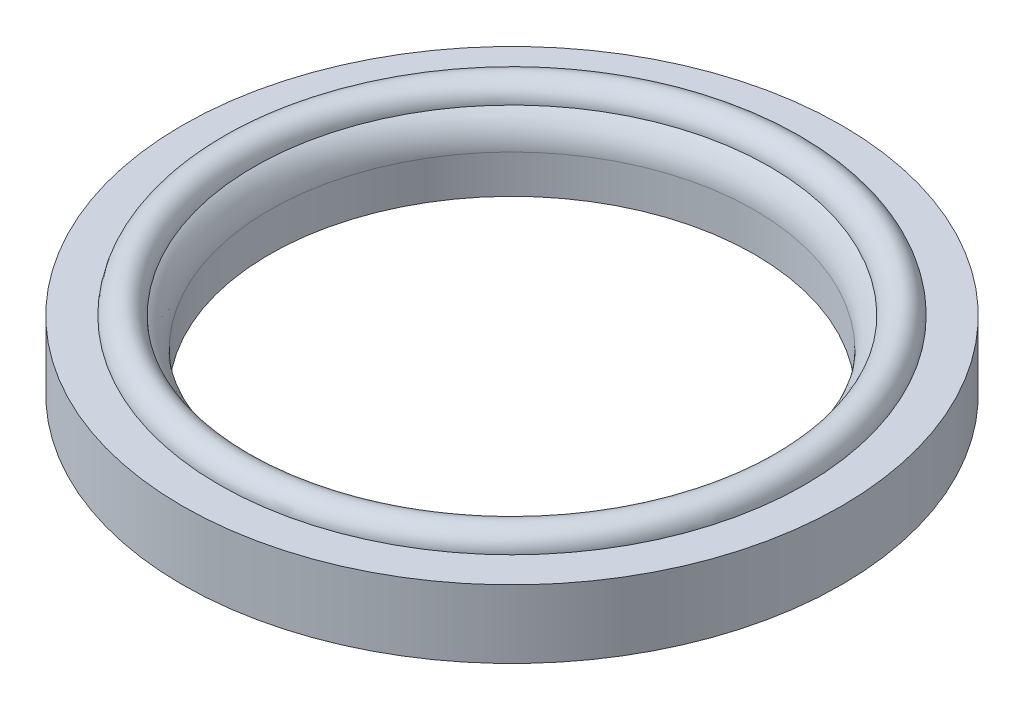
ISO-10303-21;
HEADER;
FILE_DESCRIPTION(('STEP AP214'),'2;1');
FILE_NAME('part.step','',(''),(''),'','','');
FILE_SCHEMA(('AUTOMOTIVE_DESIGN { 1 0 10303 214 1 1 1 1 }'));
ENDSEC;
DATA;
#1=APPLICATION_CONTEXT('core data for automotive mechanical design processes');
#2=APPLICATION_PROTOCOL_DEFINITION('international standard','automotive_design',2000,#1);
#3=PRODUCT_CONTEXT('',#1,'mechanical');
#4=PRODUCT('Part','Part','',(#3));
#5=PRODUCT_RELATED_PRODUCT_CATEGORY('part','',(#4));
#6=PRODUCT_DEFINITION_FORMATION('','',#4);
#7=PRODUCT_DEFINITION_CONTEXT('part definition',#1,'design');
#8=PRODUCT_DEFINITION('design','',#6,#7);
#9=PRODUCT_DEFINITION_SHAPE('','',#8);
#10=(LENGTH_UNIT() NAMED_UNIT(*) SI_UNIT(.MILLI.,.METRE.));
#11=(NAMED_UNIT(*) PLANE_ANGLE_UNIT() SI_UNIT($,.RADIAN.));
#12=(NAMED_UNIT(*) SI_UNIT($,.STERADIAN.) SOLID_ANGLE_UNIT());
#13=UNCERTAINTY_MEASURE_WITH_UNIT(LENGTH_MEASURE(1.E-05),#10,'distance_accuracy_value','');
#14=(GEOMETRIC_REPRESENTATION_CONTEXT(3) GLOBAL_UNCERTAINTY_ASSIGNED_CONTEXT((#13)) GLOBAL_UNIT_ASSIGNED_CONTEXT((#10,
#11,#12)) REPRESENTATION_CONTEXT('',''));
#15=CARTESIAN_POINT('',(0.,0.,0.));
#16=DIRECTION('',(0.,0.,1.));
#17=DIRECTION('',(1.,0.,0.));
#18=AXIS2_PLACEMENT_3D('',#15,#16,#17);
#19=CARTESIAN_POINT('',(0.,4.7625,0.));
#20=DIRECTION('',(0.,1.,0.));
#21=DIRECTION('',(0.,0.,1.));
#22=AXIS2_PLACEMENT_3D('',#19,#20,#21);
#23=PLANE('',#22);
#24=CARTESIAN_POINT('',(0.,4.7625,0.));
#25=DIRECTION('',(0.,1.,0.));
#26=DIRECTION('',(0.,0.,1.));
#27=AXIS2_PLACEMENT_3D('',#24,#25,#26);
#28=CIRCLE('',#27,23.0505);
#29=CARTESIAN_POINT('',(0.,4.7625,-23.0505));
#30=VERTEX_POINT('',#29);
#31=EDGE_CURVE('E47',#30,#30,#28,.T.);
#32=ORIENTED_EDGE('',*,*,#31,.T.);
#33=EDGE_LOOP('',(#32));
#34=FACE_BOUND('',#33,.T.);
#35=CARTESIAN_POINT('',(0.,4.7625,0.));
#36=DIRECTION('',(0.,1.,0.));
#37=DIRECTION('',(0.,0.,1.));
#38=AXIS2_PLACEMENT_3D('',#35,#36,#37);
#39=CIRCLE('',#38,20.476834476402);
#40=CARTESIAN_POINT('',(0.,4.7625,20.476834476402));
#41=VERTEX_POINT('',#40);
#42=EDGE_CURVE('E39',#41,#41,#39,.T.);
#43=ORIENTED_EDGE('',*,*,#42,.F.);
#44=EDGE_LOOP('',(#43));
#45=FACE_BOUND('',#44,.T.);
#46=ADVANCED_FACE('F32',(#34,#45),#23,.T.);
#47=CARTESIAN_POINT('',(0.,0.,0.));
#48=DIRECTION('',(0.,1.,0.));
#49=DIRECTION('',(0.,0.,1.));
#50=AXIS2_PLACEMENT_3D('',#47,#48,#49);
#51=PLANE('',#50);
#52=CARTESIAN_POINT('',(0.,0.,0.));
#53=DIRECTION('',(0.,1.,0.));
#54=DIRECTION('',(0.,0.,1.));
#55=AXIS2_PLACEMENT_3D('',#52,#53,#54);
#56=CIRCLE('',#55,23.0505);
#57=CARTESIAN_POINT('',(0.,0.,-23.0505));
#58=VERTEX_POINT('',#57);
#59=EDGE_CURVE('E50',#58,#58,#56,.T.);
#60=ORIENTED_EDGE('',*,*,#59,.F.);
#61=EDGE_LOOP('',(#60));
#62=FACE_BOUND('',#61,.T.);
#63=CARTESIAN_POINT('',(0.,0.,0.));
#64=DIRECTION('',(0.,1.,0.));
#65=DIRECTION('',(0.,0.,1.));
#66=AXIS2_PLACEMENT_3D('',#63,#64,#65);
#67=CIRCLE('',#66,16.9545);
#68=CARTESIAN_POINT('',(0.,0.,-16.9545));
#69=VERTEX_POINT('',#68);
#70=EDGE_CURVE('E53',#69,#69,#67,.T.);
#71=ORIENTED_EDGE('',*,*,#70,.T.);
#72=EDGE_LOOP('',(#71));
#73=FACE_BOUND('',#72,.T.);
#74=ADVANCED_FACE('F59',(#62,#73),#51,.F.);
#75=CARTESIAN_POINT('',(0.,4.7625,0.));
#76=DIRECTION('',(0.,-1.,0.));
#77=DIRECTION('',(0.,0.,-1.));
#78=AXIS2_PLACEMENT_3D('',#75,#76,#77);
#79=CYLINDRICAL_SURFACE('',#78,23.0505);
#80=CARTESIAN_POINT('',(0.,4.7625,-23.0505));
#81=CARTESIAN_POINT('',(0.,4.712890625,-23.0505));
#82=CARTESIAN_POINT('',(0.,4.66328125,-23.0505));
#83=CARTESIAN_POINT('',(0.,4.5640625,-23.0505));
#84=CARTESIAN_POINT('',(0.,4.514453125,-23.0505));
#85=CARTESIAN_POINT('',(0.,4.415234375,-23.0505));
#86=CARTESIAN_POINT('',(0.,4.365625,-23.0505));
#87=CARTESIAN_POINT('',(0.,4.26640625,-23.0505));
#88=CARTESIAN_POINT('',(0.,4.216796875,-23.0505));
#89=CARTESIAN_POINT('',(0.,4.117578125,-23.0505));
#90=CARTESIAN_POINT('',(0.,4.06796875,-23.0505));
#91=CARTESIAN_POINT('',(0.,3.96875,-23.0505));
#92=CARTESIAN_POINT('',(0.,3.919140625,-23.0505));
#93=CARTESIAN_POINT('',(0.,3.819921875,-23.0505));
#94=CARTESIAN_POINT('',(0.,3.7703125,-23.0505));
#95=CARTESIAN_POINT('',(0.,3.67109375,-23.0505));
#96=CARTESIAN_POINT('',(0.,3.621484375,-23.0505));
#97=CARTESIAN_POINT('',(0.,3.522265625,-23.0505));
#98=CARTESIAN_POINT('',(0.,3.47265625,-23.0505));
#99=CARTESIAN_POINT('',(0.,3.3734375,-23.0505));
#100=CARTESIAN_POINT('',(0.,3.323828125,-23.0505));
#101=CARTESIAN_POINT('',(0.,3.224609375,-23.0505));
#102=CARTESIAN_POINT('',(0.,3.175,-23.0505));
#103=CARTESIAN_POINT('',(0.,3.07578125,-23.0505));
#104=CARTESIAN_POINT('',(0.,3.026171875,-23.0505));
#105=CARTESIAN_POINT('',(0.,2.926953125,-23.0505));
#106=CARTESIAN_POINT('',(0.,2.87734375,-23.0505));
#107=CARTESIAN_POINT('',(0.,2.778125,-23.0505));
#108=CARTESIAN_POINT('',(0.,2.728515625,-23.0505));
#109=CARTESIAN_POINT('',(0.,2.629296875,-23.0505));
#110=CARTESIAN_POINT('',(0.,2.5796875,-23.0505));
#111=CARTESIAN_POINT('',(0.,2.48046875,-23.0505));
#112=CARTESIAN_POINT('',(0.,2.430859375,-23.0505));
#113=CARTESIAN_POINT('',(0.,2.331640625,-23.0505));
#114=CARTESIAN_POINT('',(0.,2.28203125,-23.0505));
#115=CARTESIAN_POINT('',(0.,2.1828125,-23.0505));
#116=CARTESIAN_POINT('',(0.,2.133203125,-23.0505));
#117=CARTESIAN_POINT('',(0.,2.033984375,-23.0505));
#118=CARTESIAN_POINT('',(0.,1.984375,-23.0505));
#119=CARTESIAN_POINT('',(0.,1.88515625,-23.0505));
#120=CARTESIAN_POINT('',(0.,1.835546875,-23.0505));
#121=CARTESIAN_POINT('',(0.,1.736328125,-23.0505));
#122=CARTESIAN_POINT('',(0.,1.68671875,-23.0505));
#123=CARTESIAN_POINT('',(0.,1.5875,-23.0505));
#124=CARTESIAN_POINT('',(0.,1.537890625,-23.0505));
#125=CARTESIAN_POINT('',(0.,1.438671875,-23.0505));
#126=CARTESIAN_POINT('',(0.,1.3890625,-23.0505));
#127=CARTESIAN_POINT('',(0.,1.28984375,-23.0505));
#128=CARTESIAN_POINT('',(0.,1.240234375,-23.0505));
#129=CARTESIAN_POINT('',(0.,1.141015625,-23.0505));
#130=CARTESIAN_POINT('',(0.,1.09140625,-23.0505));
#131=CARTESIAN_POINT('',(0.,0.992187499999999,-23.0505));
#132=CARTESIAN_POINT('',(0.,0.942578124999999,-23.0505));
#133=CARTESIAN_POINT('',(0.,0.843359375,-23.0505));
#134=CARTESIAN_POINT('',(0.,0.79375,-23.0505));
#135=CARTESIAN_POINT('',(0.,0.69453125,-23.0505));
#136=CARTESIAN_POINT('',(0.,0.644921875,-23.0505));
#137=CARTESIAN_POINT('',(0.,0.545703125,-23.0505));
#138=CARTESIAN_POINT('',(0.,0.49609375,-23.0505));
#139=CARTESIAN_POINT('',(0.,0.396875,-23.0505));
#140=CARTESIAN_POINT('',(0.,0.347265625,-23.0505));
#141=CARTESIAN_POINT('',(0.,0.248046875,-23.0505));
#142=CARTESIAN_POINT('',(0.,0.1984375,-23.0505));
#143=CARTESIAN_POINT('',(0.,0.09921875,-23.0505));
#144=CARTESIAN_POINT('',(0.,0.049609375,-23.0505));
#145=CARTESIAN_POINT('',(0.,0.,-23.0505));
#146=B_SPLINE_CURVE_WITH_KNOTS('',3,(#80,#81,#82,#83,#84,#85,#86,#87,#88,#89,#90,#91,#92,#93,
#94,#95,#96,#97,#98,#99,#100,#101,#102,#103,#104,#105,#106,#107,#108,#109,#110,#111,#112,#113,
#114,#115,#116,#117,#118,#119,#120,#121,#122,#123,#124,#125,#126,#127,#128,#129,#130,#131,#132,
#133,#134,#135,#136,#137,#138,#139,#140,#141,#142,#143,#144,#145),.UNSPECIFIED.,.F.,.F.,(4,2,2,
2,2,2,2,2,2,2,2,2,2,2,2,2,2,2,2,2,2,2,2,2,2,2,2,2,2,2,2,2,4),(0.,0.148828125,0.29765625,
0.446484375,0.5953125,0.744140625,0.892968750000001,1.041796875,1.190625,1.339453125,1.48828125,
1.637109375,1.7859375,1.934765625,2.08359375,2.232421875,2.38125,2.530078125,2.67890625,
2.827734375,2.9765625,3.125390625,3.27421875,3.423046875,3.571875,3.720703125,3.86953125,
4.018359375,4.1671875,4.316015625,4.46484375,4.613671875,4.7625),.UNSPECIFIED.);
#147=EDGE_CURVE('BSEAM64',#30,#58,#146,.T.);
#148=ORIENTED_EDGE('',*,*,#31,.F.);
#149=ORIENTED_EDGE('',*,*,#59,.T.);
#150=ORIENTED_EDGE('',*,*,#147,.T.);
#151=ORIENTED_EDGE('',*,*,#147,.F.);
#152=EDGE_LOOP('',(#148,#150,#149,#151));
#153=FACE_BOUND('',#152,.T.);
#154=ADVANCED_FACE('F64',(#153),#79,.T.);
#155=CARTESIAN_POINT('',(0.,4.7625,0.));
#156=DIRECTION('',(0.,-1.,0.));
#157=DIRECTION('',(0.,0.,-1.));
#158=AXIS2_PLACEMENT_3D('',#155,#156,#157);
#159=CYLINDRICAL_SURFACE('',#158,16.9545);
#160=CARTESIAN_POINT('',(0.,2.6840530517009,0.));
#161=DIRECTION('',(0.,1.,0.));
#162=DIRECTION('',(0.,0.,1.));
#163=AXIS2_PLACEMENT_3D('',#160,#161,#162);
#164=CIRCLE('',#163,16.9545);
#165=CARTESIAN_POINT('',(0.,2.6840530517009,-16.9545));
#166=VERTEX_POINT('',#165);
#167=EDGE_CURVE('E10',#166,#166,#164,.T.);
#168=CARTESIAN_POINT('',(0.,2.6840530517009,-16.9545));
#169=CARTESIAN_POINT('',(0.,2.65609416574568,-16.9545));
#170=CARTESIAN_POINT('',(0.,2.62813527979046,-16.9545));
#171=CARTESIAN_POINT('',(0.,2.57221750788003,-16.9545));
#172=CARTESIAN_POINT('',(0.,2.54425862192481,-16.9545));
#173=CARTESIAN_POINT('',(0.,2.48834085001437,-16.9545));
#174=CARTESIAN_POINT('',(0.,2.46038196405916,-16.9545));
#175=CARTESIAN_POINT('',(0.,2.40446419214872,-16.9545));
#176=CARTESIAN_POINT('',(0.,2.3765053061935,-16.9545));
#177=CARTESIAN_POINT('',(0.,2.32058753428307,-16.9545));
#178=CARTESIAN_POINT('',(0.,2.29262864832785,-16.9545));
#179=CARTESIAN_POINT('',(0.,2.23671087641741,-16.9545));
#180=CARTESIAN_POINT('',(0.,2.2087519904622,-16.9545));
#181=CARTESIAN_POINT('',(0.,2.15283421855176,-16.9545));
#182=CARTESIAN_POINT('',(0.,2.12487533259654,-16.9545));
#183=CARTESIAN_POINT('',(0.,2.06895756068611,-16.9545));
#184=CARTESIAN_POINT('',(0.,2.04099867473089,-16.9545));
#185=CARTESIAN_POINT('',(0.,1.98508090282045,-16.9545));
#186=CARTESIAN_POINT('',(0.,1.95712201686524,-16.9545));
#187=CARTESIAN_POINT('',(0.,1.9012042449548,-16.9545));
#188=CARTESIAN_POINT('',(0.,1.87324535899958,-16.9545));
#189=CARTESIAN_POINT('',(0.,1.81732758708915,-16.9545));
#190=CARTESIAN_POINT('',(0.,1.78936870113393,-16.9545));
#191=CARTESIAN_POINT('',(0.,1.7334509292235,-16.9545));
#192=CARTESIAN_POINT('',(0.,1.70549204326828,-16.9545));
#193=CARTESIAN_POINT('',(0.,1.64957427135784,-16.9545));
#194=CARTESIAN_POINT('',(0.,1.62161538540262,-16.9545));
#195=CARTESIAN_POINT('',(0.,1.56569761349219,-16.9545));
#196=CARTESIAN_POINT('',(0.,1.53773872753697,-16.9545));
#197=CARTESIAN_POINT('',(0.,1.48182095562654,-16.9545));
#198=CARTESIAN_POINT('',(0.,1.45386206967132,-16.9545));
#199=CARTESIAN_POINT('',(0.,1.39794429776088,-16.9545));
#200=CARTESIAN_POINT('',(0.,1.36998541180567,-16.9545));
#201=CARTESIAN_POINT('',(0.,1.31406763989523,-16.9545));
#202=CARTESIAN_POINT('',(0.,1.28610875394001,-16.9545));
#203=CARTESIAN_POINT('',(0.,1.23019098202958,-16.9545));
#204=CARTESIAN_POINT('',(0.,1.20223209607436,-16.9545));
#205=CARTESIAN_POINT('',(0.,1.14631432416392,-16.9545));
#206=CARTESIAN_POINT('',(0.,1.11835543820871,-16.9545));
#207=CARTESIAN_POINT('',(0.,1.06243766629827,-16.9545));
#208=CARTESIAN_POINT('',(0.,1.03447878034305,-16.9545));
#209=CARTESIAN_POINT('',(0.,0.978561008432618,-16.9545));
#210=CARTESIAN_POINT('',(0.,0.950602122477401,-16.9545));
#211=CARTESIAN_POINT('',(0.,0.894684350566965,-16.9545));
#212=CARTESIAN_POINT('',(0.,0.866725464611748,-16.9545));
#213=CARTESIAN_POINT('',(0.,0.810807692701313,-16.9545));
#214=CARTESIAN_POINT('',(0.,0.782848806746095,-16.9545));
#215=CARTESIAN_POINT('',(0.,0.72693103483566,-16.9545));
#216=CARTESIAN_POINT('',(0.,0.698972148880442,-16.9545));
#217=CARTESIAN_POINT('',(0.,0.643054376970007,-16.9545));
#218=CARTESIAN_POINT('',(0.,0.615095491014789,-16.9545));
#219=CARTESIAN_POINT('',(0.,0.559177719104353,-16.9545));
#220=CARTESIAN_POINT('',(0.,0.531218833149136,-16.9545));
#221=CARTESIAN_POINT('',(0.,0.4753010612387,-16.9545));
#222=CARTESIAN_POINT('',(0.,0.447342175283483,-16.9545));
#223=CARTESIAN_POINT('',(0.,0.391424403373048,-16.9545));
#224=CARTESIAN_POINT('',(0.,0.36346551741783,-16.9545));
#225=CARTESIAN_POINT('',(0.,0.307547745507395,-16.9545));
#226=CARTESIAN_POINT('',(0.,0.279588859552177,-16.9545));
#227=CARTESIAN_POINT('',(0.,0.223671087641742,-16.9545));
#228=CARTESIAN_POINT('',(0.,0.195712201686524,-16.9545));
#229=CARTESIAN_POINT('',(0.,0.139794429776088,-16.9545));
#230=CARTESIAN_POINT('',(0.,0.111835543820871,-16.9545));
#231=CARTESIAN_POINT('',(0.,0.0559177719104351,-16.9545));
#232=CARTESIAN_POINT('',(0.,0.0279588859552176,-16.9545));
#233=CARTESIAN_POINT('',(0.,0.,-16.9545));
#234=B_SPLINE_CURVE_WITH_KNOTS('',3,(#168,#169,#170,#171,#172,#173,#174,#175,#176,#177,#178,
#179,#180,#181,#182,#183,#184,#185,#186,#187,#188,#189,#190,#191,#192,#193,#194,#195,#196,#197,
#198,#199,#200,#201,#202,#203,#204,#205,#206,#207,#208,#209,#210,#211,#212,#213,#214,#215,#216,
#217,#218,#219,#220,#221,#222,#223,#224,#225,#226,#227,#228,#229,#230,#231,#232,#233),
.UNSPECIFIED.,.F.,.F.,(4,2,2,2,2,2,2,2,2,2,2,2,2,2,2,2,2,2,2,2,2,2,2,2,2,2,2,2,2,2,2,2,4),(0.,
0.0838766578656531,0.167753315731306,0.251629973596959,0.335506631462612,0.419383289328265,
0.503259947193918,0.587136605059571,0.671013262925224,0.754889920790877,0.838766578656531,
0.922643236522184,1.00651989438784,1.09039655225349,1.17427321011914,1.2581498679848,
1.34202652585045,1.4259031837161,1.50977984158175,1.59365649944741,1.67753315731306,
1.76140981517871,1.84528647304437,1.92916313091002,2.01303978877567,2.09691644664133,
2.18079310450698,2.26466976237263,2.34854642023828,2.43242307810394,2.51629973596959,
2.60017639383524,2.6840530517009),.UNSPECIFIED.);
#235=EDGE_CURVE('BSEAM61',#166,#69,#234,.T.);
#236=ORIENTED_EDGE('',*,*,#167,.T.);
#237=ORIENTED_EDGE('',*,*,#70,.F.);
#238=ORIENTED_EDGE('',*,*,#235,.T.);
#239=ORIENTED_EDGE('',*,*,#235,.F.);
#240=EDGE_LOOP('',(#236,#238,#237,#239));
#241=FACE_BOUND('',#240,.T.);
#242=ADVANCED_FACE('F61',(#241),#159,.F.);
#243=CARTESIAN_POINT('',(0.,4.72519949844497,0.));
#244=DIRECTION('',(0.,-1.,0.));
#245=DIRECTION('',(0.,0.,-1.));
#246=AXIS2_PLACEMENT_3D('',#243,#244,#245);
#247=TOROIDAL_SURFACE('',#246,19.2556572582853,1.2217467517712);
#248=ORIENTED_EDGE('',*,*,#42,.T.);
#249=EDGE_LOOP('',(#248));
#250=FACE_BOUND('',#249,.T.);
#251=CARTESIAN_POINT('',(0.,4.7625,0.));
#252=DIRECTION('',(0.,-1.,0.));
#253=DIRECTION('',(0.,0.,-1.));
#254=AXIS2_PLACEMENT_3D('',#251,#252,#253);
#255=CIRCLE('',#254,18.0344800401686);
#256=CARTESIAN_POINT('',(0.,4.7625,-18.0344800401686));
#257=VERTEX_POINT('',#256);
#258=EDGE_CURVE('E43',#257,#257,#255,.T.);
#259=ORIENTED_EDGE('',*,*,#258,.T.);
#260=EDGE_LOOP('',(#259));
#261=FACE_BOUND('',#260,.T.);
#262=ADVANCED_FACE('F63',(#250,#261),#247,.T.);
#263=CARTESIAN_POINT('',(0.,2.6840530517009,0.));
#264=DIRECTION('',(0.,1.,0.));
#265=DIRECTION('',(0.,0.,1.));
#266=AXIS2_PLACEMENT_3D('',#263,#264,#265);
#267=TOROIDAL_SURFACE('',#266,19.4945,2.54);
#268=ORIENTED_EDGE('',*,*,#258,.F.);
#269=EDGE_LOOP('',(#268));
#270=FACE_BOUND('',#269,.T.);
#271=ORIENTED_EDGE('',*,*,#167,.F.);
#272=EDGE_LOOP('',(#271));
#273=FACE_BOUND('',#272,.T.);
#274=ADVANCED_FACE('F34',(#270,#273),#267,.T.);
#275=CLOSED_SHELL('',(#46,#74,#154,#242,#262,#274));
#276=MANIFOLD_SOLID_BREP('B2',#275);
#277=ADVANCED_BREP_SHAPE_REPRESENTATION('',(#18,#276),#14);
#278=SHAPE_DEFINITION_REPRESENTATION(#9,#277);
ENDSEC;
END-ISO-10303-21;
